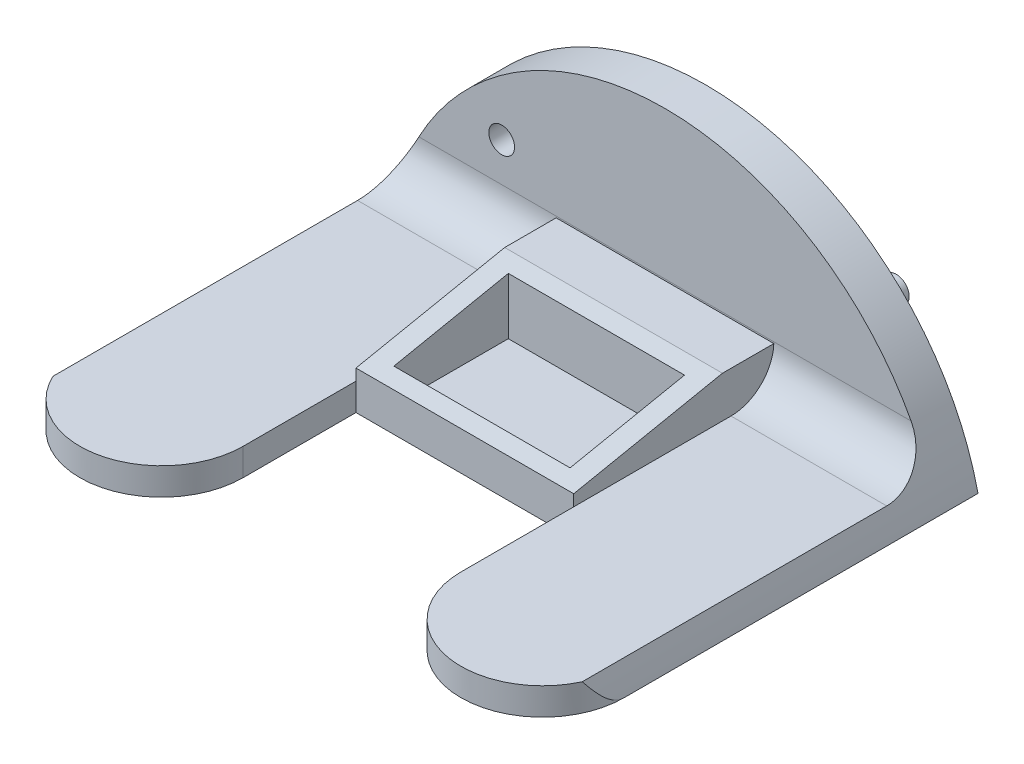
ISO-10303-21;
HEADER;
FILE_DESCRIPTION(('STEP AP214'),'2;1');
FILE_NAME('part.step','',(''),(''),'','','');
FILE_SCHEMA(('AUTOMOTIVE_DESIGN { 1 0 10303 214 1 1 1 1 }'));
ENDSEC;
DATA;
#1=APPLICATION_CONTEXT('core data for automotive mechanical design processes');
#2=APPLICATION_PROTOCOL_DEFINITION('international standard','automotive_design',2000,#1);
#3=PRODUCT_CONTEXT('',#1,'mechanical');
#4=PRODUCT('Part','Part','',(#3));
#5=PRODUCT_RELATED_PRODUCT_CATEGORY('part','',(#4));
#6=PRODUCT_DEFINITION_FORMATION('','',#4);
#7=PRODUCT_DEFINITION_CONTEXT('part definition',#1,'design');
#8=PRODUCT_DEFINITION('design','',#6,#7);
#9=PRODUCT_DEFINITION_SHAPE('','',#8);
#10=(LENGTH_UNIT() NAMED_UNIT(*) SI_UNIT(.MILLI.,.METRE.));
#11=(NAMED_UNIT(*) PLANE_ANGLE_UNIT() SI_UNIT($,.RADIAN.));
#12=(NAMED_UNIT(*) SI_UNIT($,.STERADIAN.) SOLID_ANGLE_UNIT());
#13=UNCERTAINTY_MEASURE_WITH_UNIT(LENGTH_MEASURE(1.E-05),#10,'distance_accuracy_value','');
#14=(GEOMETRIC_REPRESENTATION_CONTEXT(3) GLOBAL_UNCERTAINTY_ASSIGNED_CONTEXT((#13)) GLOBAL_UNIT_ASSIGNED_CONTEXT((#10,
#11,#12)) REPRESENTATION_CONTEXT('',''));
#15=CARTESIAN_POINT('',(0.,0.,0.));
#16=DIRECTION('',(0.,0.,1.));
#17=DIRECTION('',(1.,0.,0.));
#18=AXIS2_PLACEMENT_3D('',#15,#16,#17);
#19=CARTESIAN_POINT('',(19.05,0.,0.));
#20=DIRECTION('',(1.,0.,0.));
#21=DIRECTION('',(0.,0.,-1.));
#22=AXIS2_PLACEMENT_3D('',#19,#20,#21);
#23=PLANE('',#22);
#24=DIRECTION('',(0.,-1.,0.));
#25=VECTOR('',#24,1.);
#26=CARTESIAN_POINT('',(19.05,1.,28.1125));
#27=LINE('',#26,#25);
#28=CARTESIAN_POINT('',(19.05,3.17499999999999,28.1125));
#29=VERTEX_POINT('',#28);
#30=CARTESIAN_POINT('',(19.05,0.,28.1125));
#31=VERTEX_POINT('',#30);
#32=EDGE_CURVE('E313',#29,#31,#27,.T.);
#33=ORIENTED_EDGE('',*,*,#32,.F.);
#34=DIRECTION('',(0.,0.,-1.));
#35=VECTOR('',#34,1.);
#36=CARTESIAN_POINT('',(19.05,3.175,0.));
#37=LINE('',#36,#35);
#38=CARTESIAN_POINT('',(19.05,3.17499999999999,41.275));
#39=VERTEX_POINT('',#38);
#40=EDGE_CURVE('E343',#39,#29,#37,.T.);
#41=ORIENTED_EDGE('',*,*,#40,.F.);
#42=DIRECTION('',(0.,1.,0.));
#43=VECTOR('',#42,1.);
#44=CARTESIAN_POINT('',(19.05,0.,41.275));
#45=LINE('',#44,#43);
#46=CARTESIAN_POINT('',(19.05,0.,41.275));
#47=VERTEX_POINT('',#46);
#48=EDGE_CURVE('E350',#47,#39,#45,.T.);
#49=ORIENTED_EDGE('',*,*,#48,.F.);
#50=DIRECTION('',(0.,0.,-1.));
#51=VECTOR('',#50,1.);
#52=CARTESIAN_POINT('',(19.05,0.,0.));
#53=LINE('',#52,#51);
#54=EDGE_CURVE('E329',#47,#31,#53,.T.);
#55=ORIENTED_EDGE('',*,*,#54,.T.);
#56=EDGE_LOOP('',(#33,#41,#49,#55));
#57=FACE_BOUND('',#56,.T.);
#58=ADVANCED_FACE('F143',(#57),#23,.T.);
#59=CARTESIAN_POINT('',(44.45,0.,0.));
#60=DIRECTION('',(1.,0.,0.));
#61=DIRECTION('',(0.,0.,-1.));
#62=AXIS2_PLACEMENT_3D('',#59,#60,#61);
#63=PLANE('',#62);
#64=DIRECTION('',(0.,0.,-1.));
#65=VECTOR('',#64,1.);
#66=CARTESIAN_POINT('',(44.45,3.175,0.));
#67=LINE('',#66,#65);
#68=CARTESIAN_POINT('',(44.45,3.17499999999999,41.275));
#69=VERTEX_POINT('',#68);
#70=CARTESIAN_POINT('',(44.45,3.17499999999999,28.1125));
#71=VERTEX_POINT('',#70);
#72=EDGE_CURVE('E339',#69,#71,#67,.T.);
#73=ORIENTED_EDGE('',*,*,#72,.T.);
#74=DIRECTION('',(0.,-1.,0.));
#75=VECTOR('',#74,1.);
#76=CARTESIAN_POINT('',(44.45,1.,28.1125));
#77=LINE('',#76,#75);
#78=CARTESIAN_POINT('',(44.45,0.,28.1125));
#79=VERTEX_POINT('',#78);
#80=EDGE_CURVE('E312',#71,#79,#77,.T.);
#81=ORIENTED_EDGE('',*,*,#80,.T.);
#82=DIRECTION('',(0.,0.,-1.));
#83=VECTOR('',#82,1.);
#84=CARTESIAN_POINT('',(44.45,0.,0.));
#85=LINE('',#84,#83);
#86=CARTESIAN_POINT('',(44.45,0.,41.275));
#87=VERTEX_POINT('',#86);
#88=EDGE_CURVE('E324',#87,#79,#85,.T.);
#89=ORIENTED_EDGE('',*,*,#88,.F.);
#90=DIRECTION('',(0.,1.,0.));
#91=VECTOR('',#90,1.);
#92=CARTESIAN_POINT('',(44.45,0.,41.275));
#93=LINE('',#92,#91);
#94=EDGE_CURVE('E335',#87,#69,#93,.T.);
#95=ORIENTED_EDGE('',*,*,#94,.T.);
#96=EDGE_LOOP('',(#73,#81,#89,#95));
#97=FACE_BOUND('',#96,.T.);
#98=ADVANCED_FACE('F421',(#97),#63,.F.);
#99=CARTESIAN_POINT('',(63.5,25.4,4.7625));
#100=DIRECTION('',(0.,0.,-1.));
#101=DIRECTION('',(0.,1.,0.));
#102=AXIS2_PLACEMENT_3D('',#99,#100,#101);
#103=PLANE('',#102);
#104=CARTESIAN_POINT('',(12.7,12.7,4.7625));
#105=DIRECTION('',(0.,0.,-1.));
#106=DIRECTION('',(0.,1.,0.));
#107=AXIS2_PLACEMENT_3D('',#104,#105,#106);
#108=CIRCLE('',#107,1.5);
#109=CARTESIAN_POINT('',(12.7,14.2,4.7625));
#110=VERTEX_POINT('',#109);
#111=EDGE_CURVE('E378',#110,#110,#108,.T.);
#112=ORIENTED_EDGE('',*,*,#111,.T.);
#113=EDGE_LOOP('',(#112));
#114=FACE_BOUND('',#113,.T.);
#115=CARTESIAN_POINT('',(31.75,-7.14375,4.7625));
#116=DIRECTION('',(0.,0.,-1.));
#117=DIRECTION('',(0.,1.,0.));
#118=AXIS2_PLACEMENT_3D('',#115,#116,#117);
#119=CIRCLE('',#118,32.54375);
#120=CARTESIAN_POINT('',(3.03708369914334,8.175,4.7625));
#121=VERTEX_POINT('',#120);
#122=CARTESIAN_POINT('',(60.4629163008567,8.175,4.7625));
#123=VERTEX_POINT('',#122);
#124=EDGE_CURVE('E366',#121,#123,#119,.T.);
#125=ORIENTED_EDGE('',*,*,#124,.F.);
#126=DIRECTION('',(-1.,0.,0.));
#127=VECTOR('',#126,1.);
#128=CARTESIAN_POINT('',(19.05,8.175,4.7625));
#129=LINE('',#128,#127);
#130=EDGE_CURVE('E666',#121,#123,#129,.F.);
#131=ORIENTED_EDGE('',*,*,#130,.T.);
#132=EDGE_LOOP('',(#125,#131));
#133=FACE_BOUND('',#132,.T.);
#134=ADVANCED_FACE('F424',(#114,#133),#103,.F.);
#135=CARTESIAN_POINT('',(63.5,3.175,4.7625));
#136=DIRECTION('',(0.,-1.,0.));
#137=DIRECTION('',(0.,0.,-1.));
#138=AXIS2_PLACEMENT_3D('',#135,#136,#137);
#139=PLANE('',#138);
#140=DIRECTION('',(0.,0.,-1.));
#141=VECTOR('',#140,1.);
#142=CARTESIAN_POINT('',(62.6145275761674,3.17499999999999,50.8));
#143=LINE('',#142,#141);
#144=CARTESIAN_POINT('',(62.6145275761674,3.175,9.76249999999999));
#145=VERTEX_POINT('',#144);
#146=CARTESIAN_POINT('',(62.6145275761674,3.17499999999999,45.2855097257883));
#147=VERTEX_POINT('',#146);
#148=EDGE_CURVE('E363',#145,#147,#143,.F.);
#149=ORIENTED_EDGE('',*,*,#148,.F.);
#150=DIRECTION('',(1.,0.,0.));
#151=VECTOR('',#150,1.);
#152=CARTESIAN_POINT('',(53.5322637880837,3.175,9.7625));
#153=LINE('',#152,#151);
#154=CARTESIAN_POINT('',(44.45,3.175,9.7625));
#155=VERTEX_POINT('',#154);
#156=EDGE_CURVE('E672',#145,#155,#153,.F.);
#157=ORIENTED_EDGE('',*,*,#156,.T.);
#158=DIRECTION('',(0.,0.,-1.));
#159=VECTOR('',#158,1.);
#160=CARTESIAN_POINT('',(44.45,3.175,4.7625));
#161=LINE('',#160,#159);
#162=EDGE_CURVE('E298',#71,#155,#161,.T.);
#163=ORIENTED_EDGE('',*,*,#162,.F.);
#164=ORIENTED_EDGE('',*,*,#72,.F.);
#165=CARTESIAN_POINT('',(53.975,3.17499999999999,41.275));
#166=DIRECTION('',(0.,1.,0.));
#167=DIRECTION('',(0.,0.,1.));
#168=AXIS2_PLACEMENT_3D('',#165,#166,#167);
#169=CIRCLE('',#168,9.52499999999998);
#170=EDGE_CURVE('E316',#147,#69,#169,.F.);
#171=ORIENTED_EDGE('',*,*,#170,.F.);
#172=EDGE_LOOP('',(#149,#157,#163,#164,#171));
#173=FACE_BOUND('',#172,.T.);
#174=ADVANCED_FACE('F539',(#173),#139,.F.);
#175=DIRECTION('',(0.,0.,1.));
#176=VECTOR('',#175,1.);
#177=CARTESIAN_POINT('',(19.05,3.175,4.7625));
#178=LINE('',#177,#176);
#179=CARTESIAN_POINT('',(19.05,3.175,9.7625));
#180=VERTEX_POINT('',#179);
#181=EDGE_CURVE('E296',#180,#29,#178,.T.);
#182=ORIENTED_EDGE('',*,*,#181,.F.);
#183=DIRECTION('',(-1.,0.,0.));
#184=VECTOR('',#183,1.);
#185=CARTESIAN_POINT('',(0.885472423832565,3.175,9.7625));
#186=LINE('',#185,#184);
#187=CARTESIAN_POINT('',(0.885472423832565,3.175,9.76249999999999));
#188=VERTEX_POINT('',#187);
#189=EDGE_CURVE('E673',#180,#188,#186,.T.);
#190=ORIENTED_EDGE('',*,*,#189,.T.);
#191=DIRECTION('',(0.,0.,-1.));
#192=VECTOR('',#191,1.);
#193=CARTESIAN_POINT('',(0.885472423832565,3.17499999999999,50.8));
#194=LINE('',#193,#192);
#195=CARTESIAN_POINT('',(0.885472423832561,3.17499999999999,45.2855097257883));
#196=VERTEX_POINT('',#195);
#197=EDGE_CURVE('E353',#196,#188,#194,.T.);
#198=ORIENTED_EDGE('',*,*,#197,.F.);
#199=CARTESIAN_POINT('',(9.525,3.17499999999999,41.275));
#200=DIRECTION('',(0.,1.,0.));
#201=DIRECTION('',(0.,0.,1.));
#202=AXIS2_PLACEMENT_3D('',#199,#200,#201);
#203=CIRCLE('',#202,9.525);
#204=EDGE_CURVE('E325',#196,#39,#203,.T.);
#205=ORIENTED_EDGE('',*,*,#204,.T.);
#206=ORIENTED_EDGE('',*,*,#40,.T.);
#207=EDGE_LOOP('',(#182,#190,#198,#205,#206));
#208=FACE_BOUND('',#207,.T.);
#209=ADVANCED_FACE('F534',(#208),#139,.F.);
#210=CARTESIAN_POINT('',(63.5,0.,50.8));
#211=DIRECTION('',(0.,1.,0.));
#212=DIRECTION('',(0.,0.,1.));
#213=AXIS2_PLACEMENT_3D('',#210,#211,#212);
#214=PLANE('',#213);
#215=DIRECTION('',(1.,0.,0.));
#216=VECTOR('',#215,1.);
#217=CARTESIAN_POINT('',(0.,0.,28.1125));
#218=LINE('',#217,#216);
#219=EDGE_CURVE('E309',#31,#79,#218,.T.);
#220=ORIENTED_EDGE('',*,*,#219,.F.);
#221=ORIENTED_EDGE('',*,*,#54,.F.);
#222=CARTESIAN_POINT('',(9.525,0.,41.275));
#223=DIRECTION('',(0.,1.,0.));
#224=DIRECTION('',(0.,0.,1.));
#225=AXIS2_PLACEMENT_3D('',#222,#223,#224);
#226=CIRCLE('',#225,9.525);
#227=CARTESIAN_POINT('',(0.,0.,41.275));
#228=VERTEX_POINT('',#227);
#229=EDGE_CURVE('E332',#228,#47,#226,.T.);
#230=ORIENTED_EDGE('',*,*,#229,.F.);
#231=DIRECTION('',(0.,0.,-1.));
#232=VECTOR('',#231,1.);
#233=CARTESIAN_POINT('',(0.,0.,50.8));
#234=LINE('',#233,#232);
#235=CARTESIAN_POINT('',(0.,0.,0.));
#236=VERTEX_POINT('',#235);
#237=EDGE_CURVE('E383',#228,#236,#234,.T.);
#238=ORIENTED_EDGE('',*,*,#237,.T.);
#239=DIRECTION('',(-1.,0.,0.));
#240=VECTOR('',#239,1.);
#241=CARTESIAN_POINT('',(63.5,0.,0.));
#242=LINE('',#241,#240);
#243=CARTESIAN_POINT('',(63.5,0.,0.));
#244=VERTEX_POINT('',#243);
#245=EDGE_CURVE('E382',#244,#236,#242,.T.);
#246=ORIENTED_EDGE('',*,*,#245,.F.);
#247=DIRECTION('',(0.,0.,-1.));
#248=VECTOR('',#247,1.);
#249=CARTESIAN_POINT('',(63.5,0.,50.8));
#250=LINE('',#249,#248);
#251=CARTESIAN_POINT('',(63.5,0.,41.275));
#252=VERTEX_POINT('',#251);
#253=EDGE_CURVE('E379',#252,#244,#250,.T.);
#254=ORIENTED_EDGE('',*,*,#253,.F.);
#255=CARTESIAN_POINT('',(53.975,0.,41.275));
#256=DIRECTION('',(0.,1.,0.));
#257=DIRECTION('',(0.,0.,1.));
#258=AXIS2_PLACEMENT_3D('',#255,#256,#257);
#259=CIRCLE('',#258,9.52499999999998);
#260=EDGE_CURVE('E320',#252,#87,#259,.F.);
#261=ORIENTED_EDGE('',*,*,#260,.T.);
#262=ORIENTED_EDGE('',*,*,#88,.T.);
#263=EDGE_LOOP('',(#220,#221,#230,#238,#246,#254,#261,#262));
#264=FACE_BOUND('',#263,.T.);
#265=ADVANCED_FACE('F525',(#264),#214,.F.);
#266=CARTESIAN_POINT('',(31.75,-7.14375000000001,50.8));
#267=DIRECTION('',(0.,0.,-1.));
#268=DIRECTION('',(0.,1.,0.));
#269=AXIS2_PLACEMENT_3D('',#266,#267,#268);
#270=CYLINDRICAL_SURFACE('',#269,32.54375);
#271=ORIENTED_EDGE('',*,*,#237,.F.);
#272=CARTESIAN_POINT('',(0.,0.,41.275));
#273=CARTESIAN_POINT('',(-5.95642954721451E-06,-3.36783453152343E-05,41.3419628270709));
#274=CARTESIAN_POINT('',(0.000706580643723689,0.00314088516689763,41.4088821494676));
#275=CARTESIAN_POINT('',(0.00351201289385074,0.015595514600036,41.5420052646535));
#276=CARTESIAN_POINT('',(0.00560245899226954,0.0248647478582852,41.6082101155284));
#277=CARTESIAN_POINT('',(0.0137620591022293,0.0609345741404093,41.8028354007349));
#278=CARTESIAN_POINT('',(0.0217240212662132,0.0960213857201311,41.9296790295985));
#279=CARTESIAN_POINT('',(0.0460557315363401,0.201963217315592,42.2266929391502));
#280=CARTESIAN_POINT('',(0.0645294052066176,0.281566973152712,42.3934592079187));
#281=CARTESIAN_POINT('',(0.107914485031293,0.46433898303619,42.7139572661023));
#282=CARTESIAN_POINT('',(0.132883776245881,0.567718095670598,42.8675544379062));
#283=CARTESIAN_POINT('',(0.198235695604738,0.831624266957198,43.2193066471993));
#284=CARTESIAN_POINT('',(0.240854766119959,0.998849859582436,43.4119151412779));
#285=CARTESIAN_POINT('',(0.333457123461267,1.34916736691106,43.7804386238537));
#286=CARTESIAN_POINT('',(0.383457153080649,1.53229495387406,43.9563141234602));
#287=CARTESIAN_POINT('',(0.489893557046139,1.90830294474117,44.2956084039503));
#288=CARTESIAN_POINT('',(0.546337942864192,2.10119531856961,44.4590112488688));
#289=CARTESIAN_POINT('',(0.665071416513256,2.49288650627721,44.7758360970199));
#290=CARTESIAN_POINT('',(0.727354828416356,2.69167945850221,44.9292675523692));
#291=CARTESIAN_POINT('',(0.807666759887888,2.93941022794633,45.1136416115639));
#292=CARTESIAN_POINT('',(0.823033970285645,2.98644758423702,45.1483499841477));
#293=CARTESIAN_POINT('',(0.8540413523282,3.08062538136671,45.2172746323901));
#294=CARTESIAN_POINT('',(0.869680863415259,3.12776538074957,45.2514918083006));
#295=CARTESIAN_POINT('',(0.88547242383256,3.17499999999999,45.2855097257883));
#296=B_SPLINE_CURVE_WITH_KNOTS('',3,(#272,#273,#274,#275,#276,#277,#278,#279,#280,#281,#282,
#283,#284,#285,#286,#287,#288,#289,#290,#291,#292,#293,#294,#295),.UNSPECIFIED.,.F.,.F.,(4,2,2,
2,2,2,2,2,2,2,2,4),(0.,0.200732845270486,0.401109869061923,0.794738277011711,1.34874695683659,
1.90787264581136,2.68176305925419,3.45743671904465,4.23408539928811,5.00998680150474,
5.19131440652467,5.37225073713103),.UNSPECIFIED.);
#297=EDGE_CURVE('E405',#228,#196,#296,.T.);
#298=ORIENTED_EDGE('',*,*,#297,.T.);
#299=ORIENTED_EDGE('',*,*,#197,.T.);
#300=CARTESIAN_POINT('',(0.885472423832565,3.175,9.7625));
#301=CARTESIAN_POINT('',(0.885473029735495,3.17498167935931,9.62791740358222));
#302=CARTESIAN_POINT('',(0.887288994763568,3.18043294942423,9.49333827979033));
#303=CARTESIAN_POINT('',(0.894555927253251,3.20214179771804,9.22516693456987));
#304=CARTESIAN_POINT('',(0.900006512897366,3.21839824086113,9.09157461096806));
#305=CARTESIAN_POINT('',(0.914534437307778,3.2615473934715,8.82655674893527));
#306=CARTESIAN_POINT('',(0.923605508440354,3.28842172089194,8.69512787253611));
#307=CARTESIAN_POINT('',(0.945381616048082,3.35254951321683,8.43513614554119));
#308=CARTESIAN_POINT('',(0.958086642841242,3.38980295046807,8.30657328731045));
#309=CARTESIAN_POINT('',(0.987136782406947,3.47434325218721,8.05321301762505));
#310=CARTESIAN_POINT('',(1.00348193204755,3.52163021827694,7.92841564432269));
#311=CARTESIAN_POINT('',(1.03982050346694,3.62581743080752,7.68339764520619));
#312=CARTESIAN_POINT('',(1.05981526717338,3.68272121268593,7.56317872256049));
#313=CARTESIAN_POINT('',(1.10343517830335,3.80558670201423,7.32820353457034));
#314=CARTESIAN_POINT('',(1.12705914938336,3.87154547371472,7.2134455149007));
#315=CARTESIAN_POINT('',(1.17793232044976,4.01196233476338,6.99004060522154));
#316=CARTESIAN_POINT('',(1.20518287425895,4.08642359665568,6.88139601904514));
#317=CARTESIAN_POINT('',(1.26366170106894,4.2442267474151,6.66949030081537));
#318=CARTESIAN_POINT('',(1.29493895075093,4.32767547091564,6.56632227254035));
#319=CARTESIAN_POINT('',(1.36112890290289,4.50188699865451,6.36754585547127));
#320=CARTESIAN_POINT('',(1.39604291801385,4.59265244107164,6.27194021827766));
#321=CARTESIAN_POINT('',(1.46940236225432,4.78064700009789,6.08886762100326));
#322=CARTESIAN_POINT('',(1.50784638178023,4.8778735324125,6.00139744011197));
#323=CARTESIAN_POINT('',(1.58818581667011,5.07804475139719,5.83492783587685));
#324=CARTESIAN_POINT('',(1.63008252567374,5.18099157657432,5.75593161327106));
#325=CARTESIAN_POINT('',(1.71917953977696,5.39657242426616,5.60334632828949));
#326=CARTESIAN_POINT('',(1.76653465107995,5.50943413540611,5.53016878058392));
#327=CARTESIAN_POINT('',(1.86469151923274,5.73956085537787,5.39368316151636));
#328=CARTESIAN_POINT('',(1.91549453032479,5.85682745957549,5.33037870960707));
#329=CARTESIAN_POINT('',(2.07284036872776,6.21399218054821,5.15547928810478));
#330=CARTESIAN_POINT('',(2.18431752879616,6.45924917377995,5.05890247433906));
#331=CARTESIAN_POINT('',(2.41504776145723,6.94978387095145,4.90833825832473));
#332=CARTESIAN_POINT('',(2.53399431625487,7.19486734422423,4.85323037499344));
#333=CARTESIAN_POINT('',(2.71852130365358,7.56297604692193,4.79855024345158));
#334=CARTESIAN_POINT('',(2.78098647030246,7.68564378669805,4.78498679542733));
#335=CARTESIAN_POINT('',(2.9077303833706,7.93067197669093,4.76696414974083));
#336=CARTESIAN_POINT('',(2.97200864349814,8.05303249989642,4.76250253396914));
#337=CARTESIAN_POINT('',(3.03708369914334,8.175,4.7625));
#338=B_SPLINE_CURVE_WITH_KNOTS('',3,(#300,#301,#302,#303,#304,#305,#306,#307,#308,#309,#310,
#311,#312,#313,#314,#315,#316,#317,#318,#319,#320,#321,#322,#323,#324,#325,#326,#327,#328,#329,
#330,#331,#332,#333,#334,#335,#336,#337),.UNSPECIFIED.,.F.,.F.,(4,2,2,2,2,2,2,2,2,2,2,2,2,2,2,2,
2,2,4),(0.,0.40362004582688,0.807197697979653,1.21007970279098,1.612960634209,2.01584564628974,
2.41887909478599,2.82178218166519,3.22483609855206,3.63336158343056,4.04203503434209,
4.45054599738111,4.85921072166826,5.28653279757123,5.71401116232586,6.56899093322873,
7.39994631008084,7.81464368787796,8.22923087749864),.UNSPECIFIED.);
#339=EDGE_CURVE('E158',#188,#121,#338,.T.);
#340=ORIENTED_EDGE('',*,*,#339,.T.);
#341=ORIENTED_EDGE('',*,*,#124,.T.);
#342=CARTESIAN_POINT('',(60.4629163008567,8.175,4.7625));
#343=CARTESIAN_POINT('',(60.5404929273437,8.0296179726334,4.76249216228482));
#344=CARTESIAN_POINT('',(60.6169583561336,7.88361096749838,4.76884129396174));
#345=CARTESIAN_POINT('',(60.7672525090128,7.59129465730834,4.79452180097722));
#346=CARTESIAN_POINT('',(60.8410799080325,7.44498523832253,4.81385960654254));
#347=CARTESIAN_POINT('',(60.9858922510151,7.15257968848761,4.86588916904325));
#348=CARTESIAN_POINT('',(61.0568647735021,7.00648669967735,4.89863353373553));
#349=CARTESIAN_POINT('',(61.1952168311582,6.71628933206896,4.97765182529712));
#350=CARTESIAN_POINT('',(61.2625969175436,6.5721846507185,5.02392366943169));
#351=CARTESIAN_POINT('',(61.3936085187194,6.28669659921643,5.13026579191133));
#352=CARTESIAN_POINT('',(61.4572258612655,6.14532471967008,5.19038452144818));
#353=CARTESIAN_POINT('',(61.5800795517205,5.86721179005151,5.32426529271968));
#354=CARTESIAN_POINT('',(61.6393161932275,5.73047042997159,5.39802641896735));
#355=CARTESIAN_POINT('',(61.7529829271381,5.46330038575296,5.55881737993387));
#356=CARTESIAN_POINT('',(61.8074217808111,5.33286040017607,5.64582220281606));
#357=CARTESIAN_POINT('',(61.9113403168463,5.07950493704469,5.83278142284649));
#358=CARTESIAN_POINT('',(61.9608205653717,4.9565886010809,5.93273433861417));
#359=CARTESIAN_POINT('',(62.0505380829417,4.73002766571176,6.13575800219919));
#360=CARTESIAN_POINT('',(62.0912047904144,4.62563618522884,6.23780679965197));
#361=CARTESIAN_POINT('',(62.1680969391576,4.42545652276366,6.45155479975825));
#362=CARTESIAN_POINT('',(62.2043227924964,4.32966754277351,6.56325310538867));
#363=CARTESIAN_POINT('',(62.2722572843082,4.14770316699452,6.7955723867034));
#364=CARTESIAN_POINT('',(62.3039643836818,4.06153104889133,6.91619638134946));
#365=CARTESIAN_POINT('',(62.3627882251618,3.89981232644907,7.16541863922626));
#366=CARTESIAN_POINT('',(62.3899053414742,3.82426485600314,7.29401625122565));
#367=CARTESIAN_POINT('',(62.437655396467,3.68990895169395,7.5482173818749));
#368=CARTESIAN_POINT('',(62.4586224736456,3.63026924181272,7.67331966857877));
#369=CARTESIAN_POINT('',(62.4965983729173,3.52141187491532,7.92855278798131));
#370=CARTESIAN_POINT('',(62.5136075001835,3.47219341440698,8.0586832320869));
#371=CARTESIAN_POINT('',(62.5436522900981,3.38472484089574,8.3228475035895));
#372=CARTESIAN_POINT('',(62.5566927520202,3.34646148332376,8.45687639989718));
#373=CARTESIAN_POINT('',(62.5788308372624,3.28122171292546,8.72791934191589));
#374=CARTESIAN_POINT('',(62.5879300682715,3.25424069801268,8.86493214644503));
#375=CARTESIAN_POINT('',(62.601560467836,3.21372637669104,9.12853801729964));
#376=CARTESIAN_POINT('',(62.6064283117658,3.19920351136609,9.25496267292931));
#377=CARTESIAN_POINT('',(62.6129088100898,3.17984147750637,9.50842319213362));
#378=CARTESIAN_POINT('',(62.6145268377947,3.17498632429896,9.6354576980997));
#379=CARTESIAN_POINT('',(62.6145275761674,3.175,9.76249999999999));
#380=B_SPLINE_CURVE_WITH_KNOTS('',3,(#342,#343,#344,#345,#346,#347,#348,#349,#350,#351,#352,
#353,#354,#355,#356,#357,#358,#359,#360,#361,#362,#363,#364,#365,#366,#367,#368,#369,#370,#371,
#372,#373,#374,#375,#376,#377,#378,#379),.UNSPECIFIED.,.F.,.F.,(4,2,2,2,2,2,2,2,2,2,2,2,2,2,2,2,
2,2,4),(0.,0.494269971666129,0.98878481920649,1.48525904529635,1.98165687281912,
2.47981875126351,2.97794721216713,3.47514632742155,3.97228860869367,4.42632137970393,
4.88031198892628,5.33445686085354,5.78856469002103,6.20854686757396,6.62849665214263,
7.04793655832444,7.46720520697788,7.84884640253251,8.22985606377907),.UNSPECIFIED.);
#381=EDGE_CURVE('E12',#123,#145,#380,.T.);
#382=ORIENTED_EDGE('',*,*,#381,.T.);
#383=ORIENTED_EDGE('',*,*,#148,.T.);
#384=CARTESIAN_POINT('',(63.5,0.,41.275));
#385=CARTESIAN_POINT('',(63.5000059564295,-3.36783452704929E-05,41.3419628270709));
#386=CARTESIAN_POINT('',(63.4992934193563,0.00314088516695197,41.4088821494676));
#387=CARTESIAN_POINT('',(63.4964879871061,0.0155955146000838,41.5420052646535));
#388=CARTESIAN_POINT('',(63.4943975410077,0.0248647478583172,41.6082101155284));
#389=CARTESIAN_POINT('',(63.4862379408978,0.060934574140422,41.8028354007349));
#390=CARTESIAN_POINT('',(63.4782759787338,0.0960213857201668,41.9296790295985));
#391=CARTESIAN_POINT('',(63.4539442684637,0.201963217315653,42.2266929391502));
#392=CARTESIAN_POINT('',(63.4354705947934,0.281566973152761,42.3934592079187));
#393=CARTESIAN_POINT('',(63.3920855149687,0.464338983036227,42.7139572661023));
#394=CARTESIAN_POINT('',(63.3671162237541,0.567718095670633,42.8675544379062));
#395=CARTESIAN_POINT('',(63.3017643043953,0.831624266957227,43.2193066471993));
#396=CARTESIAN_POINT('',(63.25914523388,0.998849859582458,43.4119151412779));
#397=CARTESIAN_POINT('',(63.1665428765387,1.34916736691108,43.7804386238538));
#398=CARTESIAN_POINT('',(63.1165428469193,1.53229495387408,43.9563141234602));
#399=CARTESIAN_POINT('',(63.0101064429538,1.9083029447412,44.2956084039503));
#400=CARTESIAN_POINT('',(62.9536620571358,2.10119531856964,44.4590112488688));
#401=CARTESIAN_POINT('',(62.8349285834867,2.49288650627725,44.7758360970199));
#402=CARTESIAN_POINT('',(62.7726451715837,2.69167945850225,44.9292675523693));
#403=CARTESIAN_POINT('',(62.6923332401121,2.93941022794637,45.113641611564));
#404=CARTESIAN_POINT('',(62.6769660297143,2.98644758423706,45.1483499841477));
#405=CARTESIAN_POINT('',(62.6459586476718,3.08062538136674,45.2172746323901));
#406=CARTESIAN_POINT('',(62.6303191365847,3.12776538074958,45.2514918083006));
#407=CARTESIAN_POINT('',(62.6145275761674,3.17499999999999,45.2855097257883));
#408=B_SPLINE_CURVE_WITH_KNOTS('',3,(#384,#385,#386,#387,#388,#389,#390,#391,#392,#393,#394,
#395,#396,#397,#398,#399,#400,#401,#402,#403,#404,#405,#406,#407),.UNSPECIFIED.,.F.,.F.,(4,2,2,
2,2,2,2,2,2,2,2,4),(0.,0.200732845270482,0.401109869061922,0.794738277011716,1.3487469568366,
1.90787264581136,2.68176305925419,3.45743671904465,4.23408539928812,5.00998680150477,
5.19131440652467,5.372250737131),.UNSPECIFIED.);
#409=EDGE_CURVE('E396',#252,#147,#408,.T.);
#410=ORIENTED_EDGE('',*,*,#409,.F.);
#411=ORIENTED_EDGE('',*,*,#253,.T.);
#412=CARTESIAN_POINT('',(31.75,-7.14375,0.));
#413=DIRECTION('',(0.,0.,-1.));
#414=DIRECTION('',(0.,1.,0.));
#415=AXIS2_PLACEMENT_3D('',#412,#413,#414);
#416=CIRCLE('',#415,32.54375);
#417=EDGE_CURVE('E359',#236,#244,#416,.T.);
#418=ORIENTED_EDGE('',*,*,#417,.F.);
#419=EDGE_LOOP('',(#271,#298,#299,#340,#341,#382,#383,#410,#411,#418));
#420=FACE_BOUND('',#419,.T.);
#421=ADVANCED_FACE('F412',(#420),#270,.T.);
#422=CARTESIAN_POINT('',(63.5,0.,0.));
#423=DIRECTION('',(0.,0.,1.));
#424=DIRECTION('',(1.,0.,0.));
#425=AXIS2_PLACEMENT_3D('',#422,#423,#424);
#426=PLANE('',#425);
#427=CARTESIAN_POINT('',(50.8,12.7,0.));
#428=DIRECTION('',(0.,0.,1.));
#429=DIRECTION('',(1.,0.,0.));
#430=AXIS2_PLACEMENT_3D('',#427,#428,#429);
#431=CIRCLE('',#430,1.5);
#432=CARTESIAN_POINT('',(52.3,12.7,0.));
#433=VERTEX_POINT('',#432);
#434=EDGE_CURVE('E389',#433,#433,#431,.F.);
#435=ORIENTED_EDGE('',*,*,#434,.F.);
#436=EDGE_LOOP('',(#435));
#437=FACE_BOUND('',#436,.T.);
#438=CARTESIAN_POINT('',(12.7,12.7,0.));
#439=DIRECTION('',(0.,0.,-1.));
#440=DIRECTION('',(0.,1.,0.));
#441=AXIS2_PLACEMENT_3D('',#438,#439,#440);
#442=CIRCLE('',#441,1.5);
#443=CARTESIAN_POINT('',(12.7,14.2,0.));
#444=VERTEX_POINT('',#443);
#445=EDGE_CURVE('E374',#444,#444,#442,.T.);
#446=ORIENTED_EDGE('',*,*,#445,.F.);
#447=EDGE_LOOP('',(#446));
#448=FACE_BOUND('',#447,.T.);
#449=ORIENTED_EDGE('',*,*,#245,.T.);
#450=ORIENTED_EDGE('',*,*,#417,.T.);
#451=EDGE_LOOP('',(#449,#450));
#452=FACE_BOUND('',#451,.T.);
#453=ADVANCED_FACE('F524',(#437,#448,#452),#426,.F.);
#454=CARTESIAN_POINT('',(12.7,12.7,50.8));
#455=DIRECTION('',(0.,0.,-1.));
#456=DIRECTION('',(0.,1.,0.));
#457=AXIS2_PLACEMENT_3D('',#454,#455,#456);
#458=CYLINDRICAL_SURFACE('',#457,1.5);
#459=ORIENTED_EDGE('',*,*,#445,.T.);
#460=EDGE_LOOP('',(#459));
#461=FACE_BOUND('',#460,.T.);
#462=ORIENTED_EDGE('',*,*,#111,.F.);
#463=EDGE_LOOP('',(#462));
#464=FACE_BOUND('',#463,.T.);
#465=ADVANCED_FACE('F626',(#461,#464),#458,.F.);
#466=CARTESIAN_POINT('',(50.8,12.7,-3.175));
#467=DIRECTION('',(0.,0.,1.));
#468=DIRECTION('',(0.,-1.,0.));
#469=AXIS2_PLACEMENT_3D('',#466,#467,#468);
#470=CYLINDRICAL_SURFACE('',#469,1.5);
#471=CARTESIAN_POINT('',(50.8,12.7,-3.175));
#472=DIRECTION('',(0.,0.,-1.));
#473=DIRECTION('',(0.,1.,0.));
#474=AXIS2_PLACEMENT_3D('',#471,#472,#473);
#475=CIRCLE('',#474,1.5);
#476=CARTESIAN_POINT('',(50.8,14.2,-3.175));
#477=VERTEX_POINT('',#476);
#478=EDGE_CURVE('E370',#477,#477,#475,.T.);
#479=ORIENTED_EDGE('',*,*,#478,.F.);
#480=EDGE_LOOP('',(#479));
#481=FACE_BOUND('',#480,.T.);
#482=ORIENTED_EDGE('',*,*,#434,.T.);
#483=EDGE_LOOP('',(#482));
#484=FACE_BOUND('',#483,.T.);
#485=ADVANCED_FACE('F636',(#481,#484),#470,.T.);
#486=CARTESIAN_POINT('',(0.,0.,-3.175));
#487=DIRECTION('',(0.,0.,-1.));
#488=DIRECTION('',(0.,1.,0.));
#489=AXIS2_PLACEMENT_3D('',#486,#487,#488);
#490=PLANE('',#489);
#491=ORIENTED_EDGE('',*,*,#478,.T.);
#492=EDGE_LOOP('',(#491));
#493=FACE_BOUND('',#492,.T.);
#494=ADVANCED_FACE('F431',(#493),#490,.T.);
#495=CARTESIAN_POINT('',(9.525,0.,41.275));
#496=DIRECTION('',(0.,1.,0.));
#497=DIRECTION('',(0.,0.,1.));
#498=AXIS2_PLACEMENT_3D('',#495,#496,#497);
#499=CYLINDRICAL_SURFACE('',#498,9.525);
#500=ORIENTED_EDGE('',*,*,#204,.F.);
#501=ORIENTED_EDGE('',*,*,#297,.F.);
#502=ORIENTED_EDGE('',*,*,#229,.T.);
#503=ORIENTED_EDGE('',*,*,#48,.T.);
#504=EDGE_LOOP('',(#500,#501,#502,#503));
#505=FACE_BOUND('',#504,.T.);
#506=ADVANCED_FACE('F419',(#505),#499,.T.);
#507=CARTESIAN_POINT('',(53.975,0.,41.275));
#508=DIRECTION('',(0.,1.,0.));
#509=DIRECTION('',(0.,0.,1.));
#510=AXIS2_PLACEMENT_3D('',#507,#508,#509);
#511=CYLINDRICAL_SURFACE('',#510,9.52499999999998);
#512=ORIENTED_EDGE('',*,*,#170,.T.);
#513=ORIENTED_EDGE('',*,*,#94,.F.);
#514=ORIENTED_EDGE('',*,*,#260,.F.);
#515=ORIENTED_EDGE('',*,*,#409,.T.);
#516=EDGE_LOOP('',(#512,#513,#514,#515));
#517=FACE_BOUND('',#516,.T.);
#518=ADVANCED_FACE('F415',(#517),#511,.T.);
#519=CARTESIAN_POINT('',(0.,1.,28.1125));
#520=DIRECTION('',(0.,0.,-1.));
#521=DIRECTION('',(-1.,0.,0.));
#522=AXIS2_PLACEMENT_3D('',#519,#520,#521);
#523=PLANE('',#522);
#524=DIRECTION('',(0.,-1.,0.));
#525=VECTOR('',#524,1.);
#526=CARTESIAN_POINT('',(44.45,8.,28.1125));
#527=LINE('',#526,#525);
#528=CARTESIAN_POINT('',(44.45,4.5,28.1125));
#529=VERTEX_POINT('',#528);
#530=EDGE_CURVE('E290',#529,#71,#527,.T.);
#531=ORIENTED_EDGE('',*,*,#530,.F.);
#532=DIRECTION('',(-1.,0.,0.));
#533=VECTOR('',#532,1.);
#534=CARTESIAN_POINT('',(63.5,4.5,28.1125));
#535=LINE('',#534,#533);
#536=CARTESIAN_POINT('',(19.05,4.5,28.1125));
#537=VERTEX_POINT('',#536);
#538=EDGE_CURVE('E274',#529,#537,#535,.T.);
#539=ORIENTED_EDGE('',*,*,#538,.T.);
#540=DIRECTION('',(0.,-1.,0.));
#541=VECTOR('',#540,1.);
#542=CARTESIAN_POINT('',(19.05,8.,28.1125));
#543=LINE('',#542,#541);
#544=EDGE_CURVE('E287',#537,#29,#543,.T.);
#545=ORIENTED_EDGE('',*,*,#544,.T.);
#546=ORIENTED_EDGE('',*,*,#32,.T.);
#547=ORIENTED_EDGE('',*,*,#219,.T.);
#548=ORIENTED_EDGE('',*,*,#80,.F.);
#549=EDGE_LOOP('',(#531,#539,#545,#546,#547,#548));
#550=FACE_BOUND('',#549,.T.);
#551=ADVANCED_FACE('F285',(#550),#523,.F.);
#552=CARTESIAN_POINT('',(44.45,8.,0.));
#553=DIRECTION('',(-1.,0.,0.));
#554=DIRECTION('',(0.,0.,1.));
#555=AXIS2_PLACEMENT_3D('',#552,#553,#554);
#556=PLANE('',#555);
#557=ORIENTED_EDGE('',*,*,#162,.T.);
#558=CARTESIAN_POINT('',(44.45,8.175,9.7625));
#559=DIRECTION('',(-1.,0.,0.));
#560=DIRECTION('',(0.,0.,1.));
#561=AXIS2_PLACEMENT_3D('',#558,#559,#560);
#562=CIRCLE('',#561,5.);
#563=CARTESIAN_POINT('',(44.45,8.,4.76556343846552));
#564=VERTEX_POINT('',#563);
#565=EDGE_CURVE('E173',#155,#564,#562,.F.);
#566=ORIENTED_EDGE('',*,*,#565,.T.);
#567=DIRECTION('',(0.,0.,-1.));
#568=VECTOR('',#567,1.);
#569=CARTESIAN_POINT('',(44.45,8.,0.));
#570=LINE('',#569,#568);
#571=CARTESIAN_POINT('',(44.45,8.,10.7625));
#572=VERTEX_POINT('',#571);
#573=EDGE_CURVE('E303',#572,#564,#570,.T.);
#574=ORIENTED_EDGE('',*,*,#573,.F.);
#575=DIRECTION('',(0.,-0.197745635987355,0.980253366965886));
#576=VECTOR('',#575,1.);
#577=CARTESIAN_POINT('',(44.45,10.0862118842222,0.420849659641359));
#578=LINE('',#577,#576);
#579=EDGE_CURVE('E292',#572,#529,#578,.T.);
#580=ORIENTED_EDGE('',*,*,#579,.T.);
#581=ORIENTED_EDGE('',*,*,#530,.T.);
#582=EDGE_LOOP('',(#557,#566,#574,#580,#581));
#583=FACE_BOUND('',#582,.T.);
#584=ADVANCED_FACE('F435',(#583),#556,.F.);
#585=CARTESIAN_POINT('',(19.05,8.,0.));
#586=DIRECTION('',(1.,0.,0.));
#587=DIRECTION('',(0.,0.,-1.));
#588=AXIS2_PLACEMENT_3D('',#585,#586,#587);
#589=PLANE('',#588);
#590=DIRECTION('',(0.,0.,1.));
#591=VECTOR('',#590,1.);
#592=CARTESIAN_POINT('',(19.05,8.,0.));
#593=LINE('',#592,#591);
#594=CARTESIAN_POINT('',(19.05,8.,4.76556343846552));
#595=VERTEX_POINT('',#594);
#596=CARTESIAN_POINT('',(19.05,8.,10.7625));
#597=VERTEX_POINT('',#596);
#598=EDGE_CURVE('E696',#595,#597,#593,.T.);
#599=ORIENTED_EDGE('',*,*,#598,.F.);
#600=CARTESIAN_POINT('',(19.05,8.175,9.7625));
#601=DIRECTION('',(1.,0.,0.));
#602=DIRECTION('',(0.,0.,-1.));
#603=AXIS2_PLACEMENT_3D('',#600,#601,#602);
#604=CIRCLE('',#603,5.);
#605=EDGE_CURVE('E684',#595,#180,#604,.F.);
#606=ORIENTED_EDGE('',*,*,#605,.T.);
#607=ORIENTED_EDGE('',*,*,#181,.T.);
#608=ORIENTED_EDGE('',*,*,#544,.F.);
#609=DIRECTION('',(0.,-0.197745635987355,0.980253366965886));
#610=VECTOR('',#609,1.);
#611=CARTESIAN_POINT('',(19.05,4.5,28.1125));
#612=LINE('',#611,#610);
#613=EDGE_CURVE('E270',#597,#537,#612,.T.);
#614=ORIENTED_EDGE('',*,*,#613,.F.);
#615=EDGE_LOOP('',(#599,#606,#607,#608,#614));
#616=FACE_BOUND('',#615,.T.);
#617=ADVANCED_FACE('F294',(#616),#589,.F.);
#618=CARTESIAN_POINT('',(0.,8.,0.));
#619=DIRECTION('',(0.,1.,0.));
#620=DIRECTION('',(0.,0.,1.));
#621=AXIS2_PLACEMENT_3D('',#618,#619,#620);
#622=PLANE('',#621);
#623=ORIENTED_EDGE('',*,*,#573,.T.);
#624=DIRECTION('',(1.,0.,0.));
#625=VECTOR('',#624,1.);
#626=CARTESIAN_POINT('',(44.45,8.,4.76556343846552));
#627=LINE('',#626,#625);
#628=EDGE_CURVE('E165',#564,#595,#627,.F.);
#629=ORIENTED_EDGE('',*,*,#628,.T.);
#630=ORIENTED_EDGE('',*,*,#598,.T.);
#631=DIRECTION('',(-1.,0.,0.));
#632=VECTOR('',#631,1.);
#633=CARTESIAN_POINT('',(0.,8.,10.7625));
#634=LINE('',#633,#632);
#635=EDGE_CURVE('E277',#572,#597,#634,.T.);
#636=ORIENTED_EDGE('',*,*,#635,.F.);
#637=EDGE_LOOP('',(#623,#629,#630,#636));
#638=FACE_BOUND('',#637,.T.);
#639=ADVANCED_FACE('F443',(#638),#622,.T.);
#640=CARTESIAN_POINT('',(63.5,4.5,28.1125));
#641=DIRECTION('',(0.,-0.980253366965886,-0.197745635987355));
#642=DIRECTION('',(0.,0.197745635987355,-0.980253366965886));
#643=AXIS2_PLACEMENT_3D('',#640,#641,#642);
#644=PLANE('',#643);
#645=ORIENTED_EDGE('',*,*,#635,.T.);
#646=ORIENTED_EDGE('',*,*,#613,.T.);
#647=ORIENTED_EDGE('',*,*,#538,.F.);
#648=ORIENTED_EDGE('',*,*,#579,.F.);
#649=EDGE_LOOP('',(#645,#646,#647,#648));
#650=FACE_BOUND('',#649,.T.);
#651=DIRECTION('',(0.,0.197745635987355,-0.980253366965886));
#652=VECTOR('',#651,1.);
#653=CARTESIAN_POINT('',(42.025,10.0862118842222,0.420849659641367));
#654=LINE('',#653,#652);
#655=CARTESIAN_POINT('',(42.025,4.90345821325648,26.1125));
#656=VERTEX_POINT('',#655);
#657=CARTESIAN_POINT('',(42.025,7.59654178674352,12.7625));
#658=VERTEX_POINT('',#657);
#659=EDGE_CURVE('E733',#656,#658,#654,.T.);
#660=ORIENTED_EDGE('',*,*,#659,.F.);
#661=DIRECTION('',(-1.,0.,0.));
#662=VECTOR('',#661,1.);
#663=CARTESIAN_POINT('',(0.,4.90345821325648,26.1125));
#664=LINE('',#663,#662);
#665=CARTESIAN_POINT('',(21.475,4.90345821325648,26.1125));
#666=VERTEX_POINT('',#665);
#667=EDGE_CURVE('E737',#656,#666,#664,.T.);
#668=ORIENTED_EDGE('',*,*,#667,.T.);
#669=DIRECTION('',(0.,0.197745635987355,-0.980253366965886));
#670=VECTOR('',#669,1.);
#671=CARTESIAN_POINT('',(21.475,10.0862118842222,0.420849659641367));
#672=LINE('',#671,#670);
#673=CARTESIAN_POINT('',(21.475,7.59654178674352,12.7625));
#674=VERTEX_POINT('',#673);
#675=EDGE_CURVE('E740',#666,#674,#672,.T.);
#676=ORIENTED_EDGE('',*,*,#675,.T.);
#677=DIRECTION('',(-1.,0.,0.));
#678=VECTOR('',#677,1.);
#679=CARTESIAN_POINT('',(0.,7.59654178674351,12.7625));
#680=LINE('',#679,#678);
#681=EDGE_CURVE('E729',#658,#674,#680,.T.);
#682=ORIENTED_EDGE('',*,*,#681,.F.);
#683=EDGE_LOOP('',(#660,#668,#676,#682));
#684=FACE_BOUND('',#683,.T.);
#685=ADVANCED_FACE('F272',(#650,#684),#644,.F.);
#686=CARTESIAN_POINT('',(0.,1.,0.));
#687=DIRECTION('',(0.,-1.,0.));
#688=DIRECTION('',(0.,0.,-1.));
#689=AXIS2_PLACEMENT_3D('',#686,#687,#688);
#690=PLANE('',#689);
#691=DIRECTION('',(1.,0.,0.));
#692=VECTOR('',#691,1.);
#693=CARTESIAN_POINT('',(0.,1.,12.7625));
#694=LINE('',#693,#692);
#695=CARTESIAN_POINT('',(21.475,1.,12.7625));
#696=VERTEX_POINT('',#695);
#697=CARTESIAN_POINT('',(42.025,1.,12.7625));
#698=VERTEX_POINT('',#697);
#699=EDGE_CURVE('E713',#696,#698,#694,.T.);
#700=ORIENTED_EDGE('',*,*,#699,.F.);
#701=DIRECTION('',(0.,0.,1.));
#702=VECTOR('',#701,1.);
#703=CARTESIAN_POINT('',(21.475,1.,0.));
#704=LINE('',#703,#702);
#705=CARTESIAN_POINT('',(21.475,1.,26.1125));
#706=VERTEX_POINT('',#705);
#707=EDGE_CURVE('E725',#696,#706,#704,.T.);
#708=ORIENTED_EDGE('',*,*,#707,.T.);
#709=DIRECTION('',(1.,0.,0.));
#710=VECTOR('',#709,1.);
#711=CARTESIAN_POINT('',(0.,1.,26.1125));
#712=LINE('',#711,#710);
#713=CARTESIAN_POINT('',(42.025,1.,26.1125));
#714=VERTEX_POINT('',#713);
#715=EDGE_CURVE('E721',#706,#714,#712,.T.);
#716=ORIENTED_EDGE('',*,*,#715,.T.);
#717=DIRECTION('',(0.,0.,1.));
#718=VECTOR('',#717,1.);
#719=CARTESIAN_POINT('',(42.025,1.,0.));
#720=LINE('',#719,#718);
#721=EDGE_CURVE('E717',#698,#714,#720,.T.);
#722=ORIENTED_EDGE('',*,*,#721,.F.);
#723=EDGE_LOOP('',(#700,#708,#716,#722));
#724=FACE_BOUND('',#723,.T.);
#725=ADVANCED_FACE('F436',(#724),#690,.F.);
#726=CARTESIAN_POINT('',(21.475,8.,0.));
#727=DIRECTION('',(1.,0.,0.));
#728=DIRECTION('',(0.,0.,-1.));
#729=AXIS2_PLACEMENT_3D('',#726,#727,#728);
#730=PLANE('',#729);
#731=ORIENTED_EDGE('',*,*,#675,.F.);
#732=DIRECTION('',(0.,-1.,0.));
#733=VECTOR('',#732,1.);
#734=CARTESIAN_POINT('',(21.475,8.,26.1125));
#735=LINE('',#734,#733);
#736=EDGE_CURVE('E698',#666,#706,#735,.T.);
#737=ORIENTED_EDGE('',*,*,#736,.T.);
#738=ORIENTED_EDGE('',*,*,#707,.F.);
#739=DIRECTION('',(0.,-1.,0.));
#740=VECTOR('',#739,1.);
#741=CARTESIAN_POINT('',(21.475,8.,12.7625));
#742=LINE('',#741,#740);
#743=EDGE_CURVE('E710',#674,#696,#742,.T.);
#744=ORIENTED_EDGE('',*,*,#743,.F.);
#745=EDGE_LOOP('',(#731,#737,#738,#744));
#746=FACE_BOUND('',#745,.T.);
#747=ADVANCED_FACE('F439',(#746),#730,.T.);
#748=CARTESIAN_POINT('',(0.,8.,26.1125));
#749=DIRECTION('',(0.,0.,-1.));
#750=DIRECTION('',(-1.,0.,0.));
#751=AXIS2_PLACEMENT_3D('',#748,#749,#750);
#752=PLANE('',#751);
#753=ORIENTED_EDGE('',*,*,#667,.F.);
#754=DIRECTION('',(0.,-1.,0.));
#755=VECTOR('',#754,1.);
#756=CARTESIAN_POINT('',(42.025,8.,26.1125));
#757=LINE('',#756,#755);
#758=EDGE_CURVE('E702',#656,#714,#757,.T.);
#759=ORIENTED_EDGE('',*,*,#758,.T.);
#760=ORIENTED_EDGE('',*,*,#715,.F.);
#761=ORIENTED_EDGE('',*,*,#736,.F.);
#762=EDGE_LOOP('',(#753,#759,#760,#761));
#763=FACE_BOUND('',#762,.T.);
#764=ADVANCED_FACE('F450',(#763),#752,.T.);
#765=CARTESIAN_POINT('',(42.025,8.,0.));
#766=DIRECTION('',(1.,0.,0.));
#767=DIRECTION('',(0.,0.,-1.));
#768=AXIS2_PLACEMENT_3D('',#765,#766,#767);
#769=PLANE('',#768);
#770=ORIENTED_EDGE('',*,*,#758,.F.);
#771=ORIENTED_EDGE('',*,*,#659,.T.);
#772=DIRECTION('',(0.,-1.,0.));
#773=VECTOR('',#772,1.);
#774=CARTESIAN_POINT('',(42.025,8.,12.7625));
#775=LINE('',#774,#773);
#776=EDGE_CURVE('E707',#658,#698,#775,.T.);
#777=ORIENTED_EDGE('',*,*,#776,.T.);
#778=ORIENTED_EDGE('',*,*,#721,.T.);
#779=EDGE_LOOP('',(#770,#771,#777,#778));
#780=FACE_BOUND('',#779,.T.);
#781=ADVANCED_FACE('F454',(#780),#769,.F.);
#782=CARTESIAN_POINT('',(0.,8.,12.7625));
#783=DIRECTION('',(0.,0.,-1.));
#784=DIRECTION('',(-1.,0.,0.));
#785=AXIS2_PLACEMENT_3D('',#782,#783,#784);
#786=PLANE('',#785);
#787=ORIENTED_EDGE('',*,*,#776,.F.);
#788=ORIENTED_EDGE('',*,*,#681,.T.);
#789=ORIENTED_EDGE('',*,*,#743,.T.);
#790=ORIENTED_EDGE('',*,*,#699,.T.);
#791=EDGE_LOOP('',(#787,#788,#789,#790));
#792=FACE_BOUND('',#791,.T.);
#793=ADVANCED_FACE('F458',(#792),#786,.F.);
#794=CARTESIAN_POINT('',(63.5,8.175,9.7625));
#795=DIRECTION('',(1.,0.,0.));
#796=DIRECTION('',(0.,0.,-1.));
#797=AXIS2_PLACEMENT_3D('',#794,#795,#796);
#798=CYLINDRICAL_SURFACE('',#797,5.);
#799=ORIENTED_EDGE('',*,*,#381,.F.);
#800=ORIENTED_EDGE('',*,*,#130,.F.);
#801=ORIENTED_EDGE('',*,*,#339,.F.);
#802=ORIENTED_EDGE('',*,*,#189,.F.);
#803=ORIENTED_EDGE('',*,*,#605,.F.);
#804=ORIENTED_EDGE('',*,*,#628,.F.);
#805=ORIENTED_EDGE('',*,*,#565,.F.);
#806=ORIENTED_EDGE('',*,*,#156,.F.);
#807=EDGE_LOOP('',(#799,#800,#801,#802,#803,#804,#805,#806));
#808=FACE_BOUND('',#807,.T.);
#809=ADVANCED_FACE('F145',(#808),#798,.F.);
#810=CLOSED_SHELL('',(#58,#98,#134,#174,#209,#265,#421,#453,#465,#485,#494,#506,#518,#551,#584,
#617,#639,#685,#725,#747,#764,#781,#793,#809));
#811=MANIFOLD_SOLID_BREP('B2',#810);
#812=ADVANCED_BREP_SHAPE_REPRESENTATION('',(#18,#811),#14);
#813=SHAPE_DEFINITION_REPRESENTATION(#9,#812);
ENDSEC;
END-ISO-10303-21;
